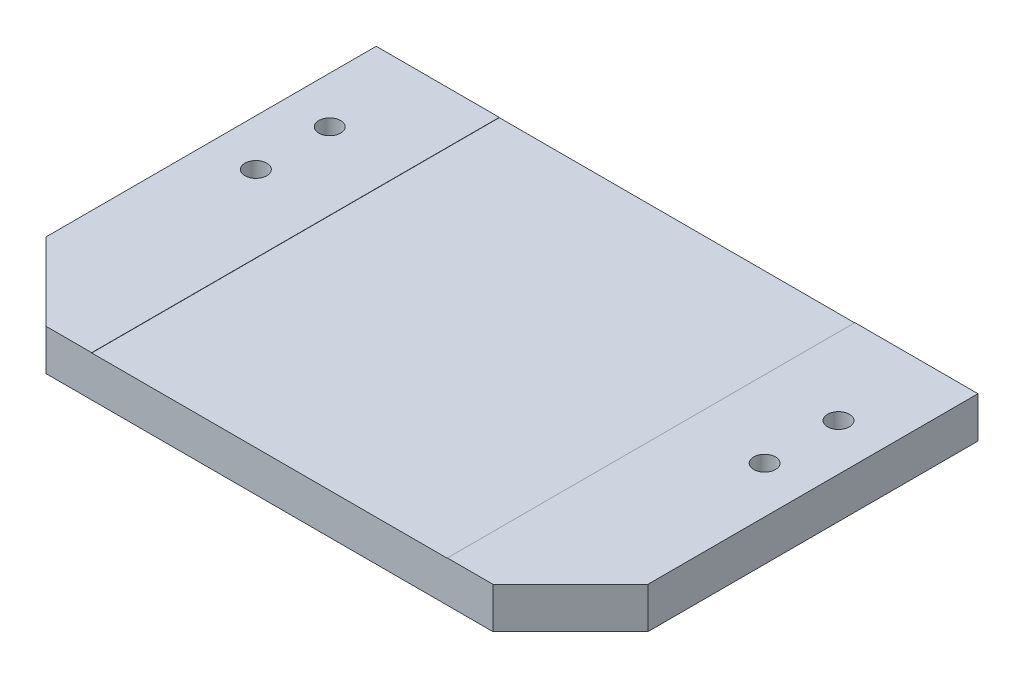
ISO-10303-21;
HEADER;
FILE_DESCRIPTION(('STEP AP214'),'2;1');
FILE_NAME('part.step','',(''),(''),'','','');
FILE_SCHEMA(('AUTOMOTIVE_DESIGN { 1 0 10303 214 1 1 1 1 }'));
ENDSEC;
DATA;
#1=APPLICATION_CONTEXT('core data for automotive mechanical design processes');
#2=APPLICATION_PROTOCOL_DEFINITION('international standard','automotive_design',2000,#1);
#3=PRODUCT_CONTEXT('',#1,'mechanical');
#4=PRODUCT('Part','Part','',(#3));
#5=PRODUCT_RELATED_PRODUCT_CATEGORY('part','',(#4));
#6=PRODUCT_DEFINITION_FORMATION('','',#4);
#7=PRODUCT_DEFINITION_CONTEXT('part definition',#1,'design');
#8=PRODUCT_DEFINITION('design','',#6,#7);
#9=PRODUCT_DEFINITION_SHAPE('','',#8);
#10=(LENGTH_UNIT() NAMED_UNIT(*) SI_UNIT(.MILLI.,.METRE.));
#11=(NAMED_UNIT(*) PLANE_ANGLE_UNIT() SI_UNIT($,.RADIAN.));
#12=(NAMED_UNIT(*) SI_UNIT($,.STERADIAN.) SOLID_ANGLE_UNIT());
#13=UNCERTAINTY_MEASURE_WITH_UNIT(LENGTH_MEASURE(1.E-05),#10,'distance_accuracy_value','');
#14=(GEOMETRIC_REPRESENTATION_CONTEXT(3) GLOBAL_UNCERTAINTY_ASSIGNED_CONTEXT((#13)) GLOBAL_UNIT_ASSIGNED_CONTEXT((#10,
#11,#12)) REPRESENTATION_CONTEXT('',''));
#15=CARTESIAN_POINT('',(0.,0.,0.));
#16=DIRECTION('',(0.,0.,1.));
#17=DIRECTION('',(1.,0.,0.));
#18=AXIS2_PLACEMENT_3D('',#15,#16,#17);
#19=CARTESIAN_POINT('',(0.,1.5,0.));
#20=DIRECTION('',(0.,-1.,0.));
#21=DIRECTION('',(0.,0.,-1.));
#22=AXIS2_PLACEMENT_3D('',#19,#20,#21);
#23=PLANE('',#22);
#24=CARTESIAN_POINT('',(-9.3,1.5,-4.05));
#25=DIRECTION('',(0.,1.,0.));
#26=DIRECTION('',(0.,0.,1.));
#27=AXIS2_PLACEMENT_3D('',#24,#25,#26);
#28=CIRCLE('',#27,0.4);
#29=CARTESIAN_POINT('',(-9.3,1.5,-3.65));
#30=VERTEX_POINT('',#29);
#31=EDGE_CURVE('E262',#30,#30,#28,.T.);
#32=ORIENTED_EDGE('',*,*,#31,.F.);
#33=EDGE_LOOP('',(#32));
#34=FACE_BOUND('',#33,.T.);
#35=CARTESIAN_POINT('',(-9.3,1.5,-1.35));
#36=DIRECTION('',(0.,1.,0.));
#37=DIRECTION('',(0.,0.,1.));
#38=AXIS2_PLACEMENT_3D('',#35,#36,#37);
#39=CIRCLE('',#38,0.399999999999999);
#40=CARTESIAN_POINT('',(-9.3,1.5,-0.95));
#41=VERTEX_POINT('',#40);
#42=EDGE_CURVE('E157',#41,#41,#39,.T.);
#43=ORIENTED_EDGE('',*,*,#42,.F.);
#44=EDGE_LOOP('',(#43));
#45=FACE_BOUND('',#44,.T.);
#46=DIRECTION('',(1.,0.,0.));
#47=VECTOR('',#46,1.);
#48=CARTESIAN_POINT('',(8.17157287525381,1.5,7.45));
#49=LINE('',#48,#47);
#50=CARTESIAN_POINT('',(-8.17157287525381,1.5,7.45));
#51=VERTEX_POINT('',#50);
#52=CARTESIAN_POINT('',(-6.5,1.5,7.45));
#53=VERTEX_POINT('',#52);
#54=EDGE_CURVE('E128',#51,#53,#49,.T.);
#55=ORIENTED_EDGE('',*,*,#54,.T.);
#56=DIRECTION('',(0.,0.,1.));
#57=VECTOR('',#56,1.);
#58=CARTESIAN_POINT('',(-6.5,1.5,-7.45));
#59=LINE('',#58,#57);
#60=CARTESIAN_POINT('',(-6.5,1.5,-7.45));
#61=VERTEX_POINT('',#60);
#62=EDGE_CURVE('E216',#61,#53,#59,.T.);
#63=ORIENTED_EDGE('',*,*,#62,.F.);
#64=DIRECTION('',(-1.,0.,0.));
#65=VECTOR('',#64,1.);
#66=CARTESIAN_POINT('',(-11.,1.5,-7.45));
#67=LINE('',#66,#65);
#68=CARTESIAN_POINT('',(-11.,1.5,-7.45));
#69=VERTEX_POINT('',#68);
#70=EDGE_CURVE('E66',#61,#69,#67,.T.);
#71=ORIENTED_EDGE('',*,*,#70,.T.);
#72=DIRECTION('',(0.,0.,1.));
#73=VECTOR('',#72,1.);
#74=CARTESIAN_POINT('',(-11.,1.5,4.62157287525381));
#75=LINE('',#74,#73);
#76=CARTESIAN_POINT('',(-11.,1.5,4.62157287525381));
#77=VERTEX_POINT('',#76);
#78=EDGE_CURVE('E170',#69,#77,#75,.T.);
#79=ORIENTED_EDGE('',*,*,#78,.T.);
#80=DIRECTION('',(0.707106781186548,0.,0.707106781186547));
#81=VECTOR('',#80,1.);
#82=CARTESIAN_POINT('',(-8.17157287525381,1.5,7.45));
#83=LINE('',#82,#81);
#84=EDGE_CURVE('E102',#77,#51,#83,.T.);
#85=ORIENTED_EDGE('',*,*,#84,.T.);
#86=EDGE_LOOP('',(#55,#63,#71,#79,#85));
#87=FACE_BOUND('',#86,.T.);
#88=ADVANCED_FACE('F41',(#34,#45,#87),#23,.F.);
#89=CARTESIAN_POINT('',(11.,1.5,-7.45));
#90=VERTEX_POINT('',#89);
#91=CARTESIAN_POINT('',(6.5,1.5,-7.45));
#92=VERTEX_POINT('',#91);
#93=EDGE_CURVE('E146',#90,#92,#67,.T.);
#94=ORIENTED_EDGE('',*,*,#93,.T.);
#95=DIRECTION('',(0.,0.,-1.));
#96=VECTOR('',#95,1.);
#97=CARTESIAN_POINT('',(6.5,1.5,-7.45));
#98=LINE('',#97,#96);
#99=CARTESIAN_POINT('',(6.5,1.5,7.45));
#100=VERTEX_POINT('',#99);
#101=EDGE_CURVE('E196',#100,#92,#98,.T.);
#102=ORIENTED_EDGE('',*,*,#101,.F.);
#103=CARTESIAN_POINT('',(8.17157287525381,1.5,7.45));
#104=VERTEX_POINT('',#103);
#105=EDGE_CURVE('E123',#100,#104,#49,.T.);
#106=ORIENTED_EDGE('',*,*,#105,.T.);
#107=DIRECTION('',(0.707106781186547,0.,-0.707106781186547));
#108=VECTOR('',#107,1.);
#109=CARTESIAN_POINT('',(11.,1.5,4.62157287525381));
#110=LINE('',#109,#108);
#111=CARTESIAN_POINT('',(11.,1.5,4.62157287525381));
#112=VERTEX_POINT('',#111);
#113=EDGE_CURVE('E113',#104,#112,#110,.T.);
#114=ORIENTED_EDGE('',*,*,#113,.T.);
#115=DIRECTION('',(0.,0.,-1.));
#116=VECTOR('',#115,1.);
#117=CARTESIAN_POINT('',(11.,1.5,-7.45));
#118=LINE('',#117,#116);
#119=EDGE_CURVE('E119',#112,#90,#118,.T.);
#120=ORIENTED_EDGE('',*,*,#119,.T.);
#121=EDGE_LOOP('',(#94,#102,#106,#114,#120));
#122=FACE_BOUND('',#121,.T.);
#123=CARTESIAN_POINT('',(9.3,1.5,-1.35));
#124=DIRECTION('',(0.,1.,0.));
#125=DIRECTION('',(0.,0.,1.));
#126=AXIS2_PLACEMENT_3D('',#123,#124,#125);
#127=CIRCLE('',#126,0.399999999999999);
#128=CARTESIAN_POINT('',(9.3,1.5,-0.95));
#129=VERTEX_POINT('',#128);
#130=EDGE_CURVE('E254',#129,#129,#127,.T.);
#131=ORIENTED_EDGE('',*,*,#130,.F.);
#132=EDGE_LOOP('',(#131));
#133=FACE_BOUND('',#132,.T.);
#134=CARTESIAN_POINT('',(9.3,1.5,-4.05));
#135=DIRECTION('',(0.,1.,0.));
#136=DIRECTION('',(0.,0.,1.));
#137=AXIS2_PLACEMENT_3D('',#134,#135,#136);
#138=CIRCLE('',#137,0.4);
#139=CARTESIAN_POINT('',(9.3,1.5,-3.65));
#140=VERTEX_POINT('',#139);
#141=EDGE_CURVE('E246',#140,#140,#138,.T.);
#142=ORIENTED_EDGE('',*,*,#141,.F.);
#143=EDGE_LOOP('',(#142));
#144=FACE_BOUND('',#143,.T.);
#145=ADVANCED_FACE('F116',(#122,#133,#144),#23,.F.);
#146=CARTESIAN_POINT('',(0.,0.,0.));
#147=DIRECTION('',(0.,-1.,0.));
#148=DIRECTION('',(0.,0.,-1.));
#149=AXIS2_PLACEMENT_3D('',#146,#147,#148);
#150=PLANE('',#149);
#151=CARTESIAN_POINT('',(9.3,0.,-1.35));
#152=DIRECTION('',(0.,1.,0.));
#153=DIRECTION('',(0.,0.,1.));
#154=AXIS2_PLACEMENT_3D('',#151,#152,#153);
#155=CIRCLE('',#154,0.399999999999999);
#156=CARTESIAN_POINT('',(9.3,0.,-0.95));
#157=VERTEX_POINT('',#156);
#158=EDGE_CURVE('E250',#157,#157,#155,.T.);
#159=ORIENTED_EDGE('',*,*,#158,.T.);
#160=EDGE_LOOP('',(#159));
#161=FACE_BOUND('',#160,.T.);
#162=CARTESIAN_POINT('',(-9.3,0.,-1.35));
#163=DIRECTION('',(0.,1.,0.));
#164=DIRECTION('',(0.,0.,1.));
#165=AXIS2_PLACEMENT_3D('',#162,#163,#164);
#166=CIRCLE('',#165,0.399999999999999);
#167=CARTESIAN_POINT('',(-9.3,0.,-0.95));
#168=VERTEX_POINT('',#167);
#169=EDGE_CURVE('E266',#168,#168,#166,.T.);
#170=ORIENTED_EDGE('',*,*,#169,.T.);
#171=EDGE_LOOP('',(#170));
#172=FACE_BOUND('',#171,.T.);
#173=DIRECTION('',(0.,0.,1.));
#174=VECTOR('',#173,1.);
#175=CARTESIAN_POINT('',(-11.,0.,4.62157287525381));
#176=LINE('',#175,#174);
#177=CARTESIAN_POINT('',(-11.,0.,-7.45));
#178=VERTEX_POINT('',#177);
#179=CARTESIAN_POINT('',(-11.,0.,4.62157287525381));
#180=VERTEX_POINT('',#179);
#181=EDGE_CURVE('E152',#178,#180,#176,.T.);
#182=ORIENTED_EDGE('',*,*,#181,.F.);
#183=DIRECTION('',(-1.,0.,0.));
#184=VECTOR('',#183,1.);
#185=CARTESIAN_POINT('',(-11.,0.,-7.45));
#186=LINE('',#185,#184);
#187=CARTESIAN_POINT('',(11.,0.,-7.45));
#188=VERTEX_POINT('',#187);
#189=EDGE_CURVE('E94',#188,#178,#186,.T.);
#190=ORIENTED_EDGE('',*,*,#189,.F.);
#191=DIRECTION('',(0.,0.,-1.));
#192=VECTOR('',#191,1.);
#193=CARTESIAN_POINT('',(11.,0.,-7.45));
#194=LINE('',#193,#192);
#195=CARTESIAN_POINT('',(11.,0.,4.62157287525381));
#196=VERTEX_POINT('',#195);
#197=EDGE_CURVE('E165',#196,#188,#194,.T.);
#198=ORIENTED_EDGE('',*,*,#197,.F.);
#199=DIRECTION('',(0.707106781186547,0.,-0.707106781186547));
#200=VECTOR('',#199,1.);
#201=CARTESIAN_POINT('',(11.,0.,4.62157287525381));
#202=LINE('',#201,#200);
#203=CARTESIAN_POINT('',(8.17157287525381,0.,7.45));
#204=VERTEX_POINT('',#203);
#205=EDGE_CURVE('E134',#204,#196,#202,.T.);
#206=ORIENTED_EDGE('',*,*,#205,.F.);
#207=DIRECTION('',(1.,0.,0.));
#208=VECTOR('',#207,1.);
#209=CARTESIAN_POINT('',(8.17157287525381,0.,7.45));
#210=LINE('',#209,#208);
#211=CARTESIAN_POINT('',(-8.17157287525381,0.,7.45));
#212=VERTEX_POINT('',#211);
#213=EDGE_CURVE('E160',#212,#204,#210,.T.);
#214=ORIENTED_EDGE('',*,*,#213,.F.);
#215=DIRECTION('',(0.707106781186548,0.,0.707106781186547));
#216=VECTOR('',#215,1.);
#217=CARTESIAN_POINT('',(-8.17157287525381,0.,7.45));
#218=LINE('',#217,#216);
#219=EDGE_CURVE('E156',#180,#212,#218,.T.);
#220=ORIENTED_EDGE('',*,*,#219,.F.);
#221=EDGE_LOOP('',(#182,#190,#198,#206,#214,#220));
#222=FACE_BOUND('',#221,.T.);
#223=CARTESIAN_POINT('',(-9.3,0.,-4.05));
#224=DIRECTION('',(0.,1.,0.));
#225=DIRECTION('',(0.,0.,1.));
#226=AXIS2_PLACEMENT_3D('',#223,#224,#225);
#227=CIRCLE('',#226,0.4);
#228=CARTESIAN_POINT('',(-9.3,0.,-3.65));
#229=VERTEX_POINT('',#228);
#230=EDGE_CURVE('E258',#229,#229,#227,.T.);
#231=ORIENTED_EDGE('',*,*,#230,.T.);
#232=EDGE_LOOP('',(#231));
#233=FACE_BOUND('',#232,.T.);
#234=CARTESIAN_POINT('',(9.3,0.,-4.05));
#235=DIRECTION('',(0.,1.,0.));
#236=DIRECTION('',(0.,0.,1.));
#237=AXIS2_PLACEMENT_3D('',#234,#235,#236);
#238=CIRCLE('',#237,0.4);
#239=CARTESIAN_POINT('',(9.3,0.,-3.65));
#240=VERTEX_POINT('',#239);
#241=EDGE_CURVE('E241',#240,#240,#238,.T.);
#242=ORIENTED_EDGE('',*,*,#241,.T.);
#243=EDGE_LOOP('',(#242));
#244=FACE_BOUND('',#243,.T.);
#245=ADVANCED_FACE('F187',(#161,#172,#222,#233,#244),#150,.T.);
#246=CARTESIAN_POINT('',(-11.,1.5,4.62157287525381));
#247=DIRECTION('',(1.,0.,0.));
#248=DIRECTION('',(0.,0.,-1.));
#249=AXIS2_PLACEMENT_3D('',#246,#247,#248);
#250=PLANE('',#249);
#251=ORIENTED_EDGE('',*,*,#181,.T.);
#252=DIRECTION('',(0.,-1.,0.));
#253=VECTOR('',#252,1.);
#254=CARTESIAN_POINT('',(-11.,1.5,4.62157287525381));
#255=LINE('',#254,#253);
#256=EDGE_CURVE('E11',#77,#180,#255,.T.);
#257=ORIENTED_EDGE('',*,*,#256,.F.);
#258=ORIENTED_EDGE('',*,*,#78,.F.);
#259=DIRECTION('',(0.,-1.,0.));
#260=VECTOR('',#259,1.);
#261=CARTESIAN_POINT('',(-11.,1.5,-7.45));
#262=LINE('',#261,#260);
#263=EDGE_CURVE('E151',#69,#178,#262,.T.);
#264=ORIENTED_EDGE('',*,*,#263,.T.);
#265=EDGE_LOOP('',(#251,#257,#258,#264));
#266=FACE_BOUND('',#265,.T.);
#267=ADVANCED_FACE('F43',(#266),#250,.F.);
#268=CARTESIAN_POINT('',(-8.17157287525381,1.5,7.45));
#269=DIRECTION('',(0.707106781186547,0.,-0.707106781186548));
#270=DIRECTION('',(-0.707106781186548,0.,-0.707106781186547));
#271=AXIS2_PLACEMENT_3D('',#268,#269,#270);
#272=PLANE('',#271);
#273=ORIENTED_EDGE('',*,*,#219,.T.);
#274=DIRECTION('',(0.,-1.,0.));
#275=VECTOR('',#274,1.);
#276=CARTESIAN_POINT('',(-8.17157287525381,1.5,7.45));
#277=LINE('',#276,#275);
#278=EDGE_CURVE('E50',#51,#212,#277,.T.);
#279=ORIENTED_EDGE('',*,*,#278,.F.);
#280=ORIENTED_EDGE('',*,*,#84,.F.);
#281=ORIENTED_EDGE('',*,*,#256,.T.);
#282=EDGE_LOOP('',(#273,#279,#280,#281));
#283=FACE_BOUND('',#282,.T.);
#284=ADVANCED_FACE('F284',(#283),#272,.F.);
#285=CARTESIAN_POINT('',(8.17157287525381,1.5,7.45));
#286=DIRECTION('',(0.,0.,-1.));
#287=DIRECTION('',(-1.,0.,0.));
#288=AXIS2_PLACEMENT_3D('',#285,#286,#287);
#289=PLANE('',#288);
#290=DIRECTION('',(1.,0.,0.));
#291=VECTOR('',#290,1.);
#292=CARTESIAN_POINT('',(-6.5,1.49,7.45));
#293=LINE('',#292,#291);
#294=CARTESIAN_POINT('',(-6.5,1.49,7.45));
#295=VERTEX_POINT('',#294);
#296=CARTESIAN_POINT('',(6.5,1.49,7.45));
#297=VERTEX_POINT('',#296);
#298=EDGE_CURVE('E222',#295,#297,#293,.T.);
#299=ORIENTED_EDGE('',*,*,#298,.F.);
#300=DIRECTION('',(0.,1.,0.));
#301=VECTOR('',#300,1.);
#302=CARTESIAN_POINT('',(-6.5,1.49,7.45));
#303=LINE('',#302,#301);
#304=EDGE_CURVE('E212',#295,#53,#303,.T.);
#305=ORIENTED_EDGE('',*,*,#304,.T.);
#306=ORIENTED_EDGE('',*,*,#54,.F.);
#307=ORIENTED_EDGE('',*,*,#278,.T.);
#308=ORIENTED_EDGE('',*,*,#213,.T.);
#309=DIRECTION('',(0.,-1.,0.));
#310=VECTOR('',#309,1.);
#311=CARTESIAN_POINT('',(8.17157287525381,1.5,7.45));
#312=LINE('',#311,#310);
#313=EDGE_CURVE('E138',#104,#204,#312,.T.);
#314=ORIENTED_EDGE('',*,*,#313,.F.);
#315=ORIENTED_EDGE('',*,*,#105,.F.);
#316=DIRECTION('',(0.,1.,0.));
#317=VECTOR('',#316,1.);
#318=CARTESIAN_POINT('',(6.5,1.49,7.45));
#319=LINE('',#318,#317);
#320=EDGE_CURVE('E218',#297,#100,#319,.T.);
#321=ORIENTED_EDGE('',*,*,#320,.F.);
#322=EDGE_LOOP('',(#299,#305,#306,#307,#308,#314,#315,#321));
#323=FACE_BOUND('',#322,.T.);
#324=ADVANCED_FACE('F182',(#323),#289,.F.);
#325=CARTESIAN_POINT('',(11.,1.5,4.62157287525381));
#326=DIRECTION('',(-0.707106781186548,0.,-0.707106781186548));
#327=DIRECTION('',(-0.707106781186548,0.,0.707106781186548));
#328=AXIS2_PLACEMENT_3D('',#325,#326,#327);
#329=PLANE('',#328);
#330=ORIENTED_EDGE('',*,*,#205,.T.);
#331=DIRECTION('',(0.,-1.,0.));
#332=VECTOR('',#331,1.);
#333=CARTESIAN_POINT('',(11.,1.5,4.62157287525381));
#334=LINE('',#333,#332);
#335=EDGE_CURVE('E131',#112,#196,#334,.T.);
#336=ORIENTED_EDGE('',*,*,#335,.F.);
#337=ORIENTED_EDGE('',*,*,#113,.F.);
#338=ORIENTED_EDGE('',*,*,#313,.T.);
#339=EDGE_LOOP('',(#330,#336,#337,#338));
#340=FACE_BOUND('',#339,.T.);
#341=ADVANCED_FACE('F132',(#340),#329,.F.);
#342=CARTESIAN_POINT('',(11.,1.5,-7.45));
#343=DIRECTION('',(-1.,0.,0.));
#344=DIRECTION('',(0.,0.,1.));
#345=AXIS2_PLACEMENT_3D('',#342,#343,#344);
#346=PLANE('',#345);
#347=ORIENTED_EDGE('',*,*,#197,.T.);
#348=DIRECTION('',(0.,-1.,0.));
#349=VECTOR('',#348,1.);
#350=CARTESIAN_POINT('',(11.,1.5,-7.45));
#351=LINE('',#350,#349);
#352=EDGE_CURVE('E139',#90,#188,#351,.T.);
#353=ORIENTED_EDGE('',*,*,#352,.F.);
#354=ORIENTED_EDGE('',*,*,#119,.F.);
#355=ORIENTED_EDGE('',*,*,#335,.T.);
#356=EDGE_LOOP('',(#347,#353,#354,#355));
#357=FACE_BOUND('',#356,.T.);
#358=ADVANCED_FACE('F141',(#357),#346,.F.);
#359=CARTESIAN_POINT('',(-11.,1.5,-7.45));
#360=DIRECTION('',(0.,0.,1.));
#361=DIRECTION('',(1.,0.,0.));
#362=AXIS2_PLACEMENT_3D('',#359,#360,#361);
#363=PLANE('',#362);
#364=ORIENTED_EDGE('',*,*,#70,.F.);
#365=DIRECTION('',(0.,1.,0.));
#366=VECTOR('',#365,1.);
#367=CARTESIAN_POINT('',(-6.5,1.49,-7.45));
#368=LINE('',#367,#366);
#369=CARTESIAN_POINT('',(-6.5,1.49,-7.45));
#370=VERTEX_POINT('',#369);
#371=EDGE_CURVE('E238',#370,#61,#368,.T.);
#372=ORIENTED_EDGE('',*,*,#371,.F.);
#373=DIRECTION('',(-1.,0.,0.));
#374=VECTOR('',#373,1.);
#375=CARTESIAN_POINT('',(-6.5,1.49,-7.45));
#376=LINE('',#375,#374);
#377=CARTESIAN_POINT('',(6.5,1.49,-7.45));
#378=VERTEX_POINT('',#377);
#379=EDGE_CURVE('E219',#378,#370,#376,.T.);
#380=ORIENTED_EDGE('',*,*,#379,.F.);
#381=DIRECTION('',(0.,1.,0.));
#382=VECTOR('',#381,1.);
#383=CARTESIAN_POINT('',(6.5,1.49,-7.45));
#384=LINE('',#383,#382);
#385=EDGE_CURVE('E193',#378,#92,#384,.T.);
#386=ORIENTED_EDGE('',*,*,#385,.T.);
#387=ORIENTED_EDGE('',*,*,#93,.F.);
#388=ORIENTED_EDGE('',*,*,#352,.T.);
#389=ORIENTED_EDGE('',*,*,#189,.T.);
#390=ORIENTED_EDGE('',*,*,#263,.F.);
#391=EDGE_LOOP('',(#364,#372,#380,#386,#387,#388,#389,#390));
#392=FACE_BOUND('',#391,.T.);
#393=ADVANCED_FACE('F189',(#392),#363,.F.);
#394=CARTESIAN_POINT('',(-9.3,1.5,-1.35));
#395=DIRECTION('',(0.,-1.,0.));
#396=DIRECTION('',(0.,0.,-1.));
#397=AXIS2_PLACEMENT_3D('',#394,#395,#396);
#398=CYLINDRICAL_SURFACE('',#397,0.399999999999999);
#399=ORIENTED_EDGE('',*,*,#42,.T.);
#400=EDGE_LOOP('',(#399));
#401=FACE_BOUND('',#400,.T.);
#402=ORIENTED_EDGE('',*,*,#169,.F.);
#403=EDGE_LOOP('',(#402));
#404=FACE_BOUND('',#403,.T.);
#405=ADVANCED_FACE('F301',(#401,#404),#398,.F.);
#406=CARTESIAN_POINT('',(-9.3,1.5,-4.05));
#407=DIRECTION('',(0.,-1.,0.));
#408=DIRECTION('',(0.,0.,-1.));
#409=AXIS2_PLACEMENT_3D('',#406,#407,#408);
#410=CYLINDRICAL_SURFACE('',#409,0.4);
#411=ORIENTED_EDGE('',*,*,#31,.T.);
#412=EDGE_LOOP('',(#411));
#413=FACE_BOUND('',#412,.T.);
#414=ORIENTED_EDGE('',*,*,#230,.F.);
#415=EDGE_LOOP('',(#414));
#416=FACE_BOUND('',#415,.T.);
#417=ADVANCED_FACE('F330',(#413,#416),#410,.F.);
#418=CARTESIAN_POINT('',(9.3,1.5,-1.35));
#419=DIRECTION('',(0.,-1.,0.));
#420=DIRECTION('',(0.,0.,-1.));
#421=AXIS2_PLACEMENT_3D('',#418,#419,#420);
#422=CYLINDRICAL_SURFACE('',#421,0.399999999999999);
#423=ORIENTED_EDGE('',*,*,#130,.T.);
#424=EDGE_LOOP('',(#423));
#425=FACE_BOUND('',#424,.T.);
#426=ORIENTED_EDGE('',*,*,#158,.F.);
#427=EDGE_LOOP('',(#426));
#428=FACE_BOUND('',#427,.T.);
#429=ADVANCED_FACE('F337',(#425,#428),#422,.F.);
#430=CARTESIAN_POINT('',(9.3,1.5,-4.05));
#431=DIRECTION('',(0.,-1.,0.));
#432=DIRECTION('',(0.,0.,-1.));
#433=AXIS2_PLACEMENT_3D('',#430,#431,#432);
#434=CYLINDRICAL_SURFACE('',#433,0.4);
#435=ORIENTED_EDGE('',*,*,#141,.T.);
#436=EDGE_LOOP('',(#435));
#437=FACE_BOUND('',#436,.T.);
#438=ORIENTED_EDGE('',*,*,#241,.F.);
#439=EDGE_LOOP('',(#438));
#440=FACE_BOUND('',#439,.T.);
#441=ADVANCED_FACE('F344',(#437,#440),#434,.F.);
#442=CARTESIAN_POINT('',(-6.5,1.49,-7.45));
#443=DIRECTION('',(-1.,0.,0.));
#444=DIRECTION('',(0.,0.,1.));
#445=AXIS2_PLACEMENT_3D('',#442,#443,#444);
#446=PLANE('',#445);
#447=ORIENTED_EDGE('',*,*,#62,.T.);
#448=ORIENTED_EDGE('',*,*,#304,.F.);
#449=DIRECTION('',(0.,0.,1.));
#450=VECTOR('',#449,1.);
#451=CARTESIAN_POINT('',(-6.5,1.49,-7.45));
#452=LINE('',#451,#450);
#453=EDGE_CURVE('E215',#370,#295,#452,.T.);
#454=ORIENTED_EDGE('',*,*,#453,.F.);
#455=ORIENTED_EDGE('',*,*,#371,.T.);
#456=EDGE_LOOP('',(#447,#448,#454,#455));
#457=FACE_BOUND('',#456,.T.);
#458=ADVANCED_FACE('F214',(#457),#446,.F.);
#459=CARTESIAN_POINT('',(6.5,1.49,-7.45));
#460=DIRECTION('',(1.,0.,0.));
#461=DIRECTION('',(0.,0.,-1.));
#462=AXIS2_PLACEMENT_3D('',#459,#460,#461);
#463=PLANE('',#462);
#464=ORIENTED_EDGE('',*,*,#101,.T.);
#465=ORIENTED_EDGE('',*,*,#385,.F.);
#466=DIRECTION('',(0.,0.,-1.));
#467=VECTOR('',#466,1.);
#468=CARTESIAN_POINT('',(6.5,1.49,-7.45));
#469=LINE('',#468,#467);
#470=EDGE_CURVE('E57',#297,#378,#469,.T.);
#471=ORIENTED_EDGE('',*,*,#470,.F.);
#472=ORIENTED_EDGE('',*,*,#320,.T.);
#473=EDGE_LOOP('',(#464,#465,#471,#472));
#474=FACE_BOUND('',#473,.T.);
#475=ADVANCED_FACE('F358',(#474),#463,.F.);
#476=CARTESIAN_POINT('',(0.,1.49,0.));
#477=DIRECTION('',(0.,1.,0.));
#478=DIRECTION('',(0.,0.,1.));
#479=AXIS2_PLACEMENT_3D('',#476,#477,#478);
#480=PLANE('',#479);
#481=ORIENTED_EDGE('',*,*,#453,.T.);
#482=ORIENTED_EDGE('',*,*,#298,.T.);
#483=ORIENTED_EDGE('',*,*,#470,.T.);
#484=ORIENTED_EDGE('',*,*,#379,.T.);
#485=EDGE_LOOP('',(#481,#482,#483,#484));
#486=FACE_BOUND('',#485,.T.);
#487=ADVANCED_FACE('F221',(#486),#480,.T.);
#488=CLOSED_SHELL('',(#88,#145,#245,#267,#284,#324,#341,#358,#393,#405,#417,#429,#441,#458,#475,#487));
#489=MANIFOLD_SOLID_BREP('B2',#488);
#490=ADVANCED_BREP_SHAPE_REPRESENTATION('',(#18,#489),#14);
#491=SHAPE_DEFINITION_REPRESENTATION(#9,#490);
ENDSEC;
END-ISO-10303-21;
